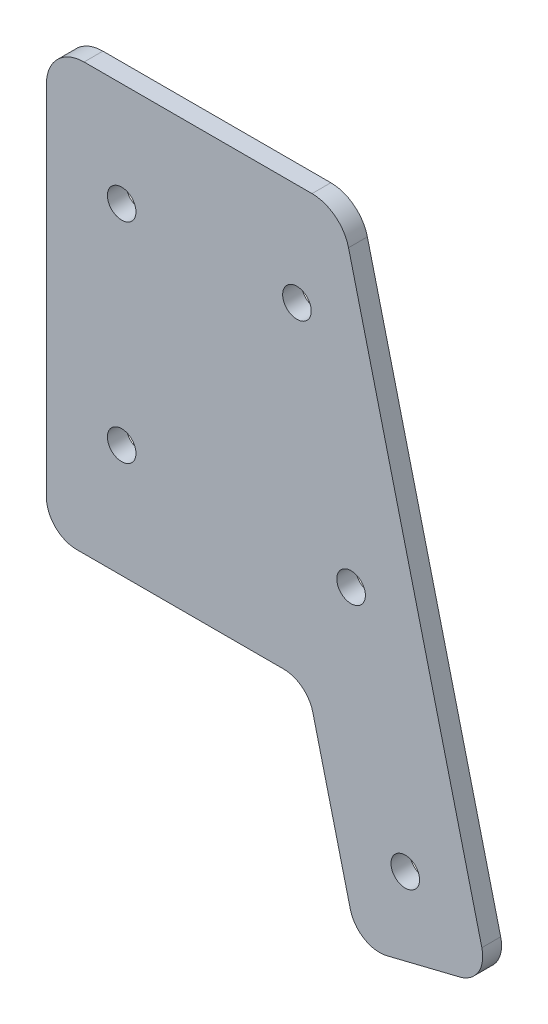
ISO-10303-21;
HEADER;
FILE_DESCRIPTION(('STEP AP214'),'2;1');
FILE_NAME('part.step','',(''),(''),'','','');
FILE_SCHEMA(('AUTOMOTIVE_DESIGN { 1 0 10303 214 1 1 1 1 }'));
ENDSEC;
DATA;
#1=APPLICATION_CONTEXT('core data for automotive mechanical design processes');
#2=APPLICATION_PROTOCOL_DEFINITION('international standard','automotive_design',2000,#1);
#3=PRODUCT_CONTEXT('',#1,'mechanical');
#4=PRODUCT('Part','Part','',(#3));
#5=PRODUCT_RELATED_PRODUCT_CATEGORY('part','',(#4));
#6=PRODUCT_DEFINITION_FORMATION('','',#4);
#7=PRODUCT_DEFINITION_CONTEXT('part definition',#1,'design');
#8=PRODUCT_DEFINITION('design','',#6,#7);
#9=PRODUCT_DEFINITION_SHAPE('','',#8);
#10=(LENGTH_UNIT() NAMED_UNIT(*) SI_UNIT(.MILLI.,.METRE.));
#11=(NAMED_UNIT(*) PLANE_ANGLE_UNIT() SI_UNIT($,.RADIAN.));
#12=(NAMED_UNIT(*) SI_UNIT($,.STERADIAN.) SOLID_ANGLE_UNIT());
#13=UNCERTAINTY_MEASURE_WITH_UNIT(LENGTH_MEASURE(1.E-05),#10,'distance_accuracy_value','');
#14=(GEOMETRIC_REPRESENTATION_CONTEXT(3) GLOBAL_UNCERTAINTY_ASSIGNED_CONTEXT((#13)) GLOBAL_UNIT_ASSIGNED_CONTEXT((#10,
#11,#12)) REPRESENTATION_CONTEXT('',''));
#15=CARTESIAN_POINT('',(0.,0.,0.));
#16=DIRECTION('',(0.,0.,1.));
#17=DIRECTION('',(1.,0.,0.));
#18=AXIS2_PLACEMENT_3D('',#15,#16,#17);
#19=CARTESIAN_POINT('',(37.552869907065,49.7064913238145,3.175));
#20=DIRECTION('',(0.,0.,-1.));
#21=DIRECTION('',(-1.,0.,0.));
#22=AXIS2_PLACEMENT_3D('',#19,#20,#21);
#23=CYLINDRICAL_SURFACE('',#22,5.08000000000005);
#24=CARTESIAN_POINT('',(37.552869907065,49.7064913238145,0.));
#25=DIRECTION('',(0.,0.,-1.));
#26=DIRECTION('',(-1.,0.,0.));
#27=AXIS2_PLACEMENT_3D('',#24,#25,#26);
#28=CIRCLE('',#27,5.08000000000005);
#29=CARTESIAN_POINT('',(37.552869907065,54.7864913238146,0.));
#30=VERTEX_POINT('',#29);
#31=CARTESIAN_POINT('',(42.4845353185074,50.925128377897,0.));
#32=VERTEX_POINT('',#31);
#33=EDGE_CURVE('E155',#30,#32,#28,.T.);
#34=ORIENTED_EDGE('',*,*,#33,.T.);
#35=DIRECTION('',(0.,0.,-1.));
#36=VECTOR('',#35,1.);
#37=CARTESIAN_POINT('',(42.4845353185074,50.925128377897,3.175));
#38=LINE('',#37,#36);
#39=CARTESIAN_POINT('',(42.4845353185074,50.925128377897,3.175));
#40=VERTEX_POINT('',#39);
#41=EDGE_CURVE('E11',#40,#32,#38,.T.);
#42=ORIENTED_EDGE('',*,*,#41,.F.);
#43=CARTESIAN_POINT('',(37.552869907065,49.7064913238145,3.175));
#44=DIRECTION('',(0.,0.,-1.));
#45=DIRECTION('',(-1.,0.,0.));
#46=AXIS2_PLACEMENT_3D('',#43,#44,#45);
#47=CIRCLE('',#46,5.08000000000005);
#48=CARTESIAN_POINT('',(37.552869907065,54.7864913238146,3.175));
#49=VERTEX_POINT('',#48);
#50=EDGE_CURVE('E178',#49,#40,#47,.T.);
#51=ORIENTED_EDGE('',*,*,#50,.F.);
#52=DIRECTION('',(0.,0.,-1.));
#53=VECTOR('',#52,1.);
#54=CARTESIAN_POINT('',(37.552869907065,54.7864913238146,3.175));
#55=LINE('',#54,#53);
#56=EDGE_CURVE('E151',#49,#30,#55,.T.);
#57=ORIENTED_EDGE('',*,*,#56,.T.);
#58=EDGE_LOOP('',(#34,#42,#51,#57));
#59=FACE_BOUND('',#58,.T.);
#60=ADVANCED_FACE('F35',(#59),#23,.F.);
#61=CARTESIAN_POINT('',(48.8138921886152,25.3110456217395,3.175));
#62=DIRECTION('',(0.970800277842994,0.239889183874483,0.));
#63=DIRECTION('',(-0.239889183874483,0.970800277842994,0.));
#64=AXIS2_PLACEMENT_3D('',#61,#62,#63);
#65=PLANE('',#64);
#66=DIRECTION('',(0.239889183874483,-0.970800277842994,0.));
#67=VECTOR('',#66,1.);
#68=CARTESIAN_POINT('',(48.8138921886152,25.3110456217395,0.));
#69=LINE('',#68,#67);
#70=CARTESIAN_POINT('',(48.8138921886152,25.3110456217395,0.));
#71=VERTEX_POINT('',#70);
#72=EDGE_CURVE('E158',#32,#71,#69,.T.);
#73=ORIENTED_EDGE('',*,*,#72,.T.);
#74=DIRECTION('',(0.,0.,-1.));
#75=VECTOR('',#74,1.);
#76=CARTESIAN_POINT('',(48.8138921886152,25.3110456217395,3.175));
#77=LINE('',#76,#75);
#78=CARTESIAN_POINT('',(48.8138921886152,25.3110456217395,3.175));
#79=VERTEX_POINT('',#78);
#80=EDGE_CURVE('E43',#79,#71,#77,.T.);
#81=ORIENTED_EDGE('',*,*,#80,.F.);
#82=DIRECTION('',(0.239889183874483,-0.970800277842994,0.));
#83=VECTOR('',#82,1.);
#84=CARTESIAN_POINT('',(48.8138921886152,25.3110456217395,3.175));
#85=LINE('',#84,#83);
#86=EDGE_CURVE('E106',#40,#79,#85,.T.);
#87=ORIENTED_EDGE('',*,*,#86,.F.);
#88=ORIENTED_EDGE('',*,*,#41,.T.);
#89=EDGE_LOOP('',(#73,#81,#87,#88));
#90=FACE_BOUND('',#89,.T.);
#91=ADVANCED_FACE('F257',(#90),#65,.F.);
#92=CARTESIAN_POINT('',(53.7455576000576,26.5296826758218,3.175));
#93=DIRECTION('',(0.,0.,-1.));
#94=DIRECTION('',(-1.,0.,0.));
#95=AXIS2_PLACEMENT_3D('',#92,#93,#94);
#96=CYLINDRICAL_SURFACE('',#95,5.08);
#97=CARTESIAN_POINT('',(53.7455576000576,26.5296826758218,0.));
#98=DIRECTION('',(0.,0.,1.));
#99=DIRECTION('',(-1.,0.,0.));
#100=AXIS2_PLACEMENT_3D('',#97,#98,#99);
#101=CIRCLE('',#100,5.08);
#102=CARTESIAN_POINT('',(54.96419465414,21.5980172643794,0.));
#103=VERTEX_POINT('',#102);
#104=EDGE_CURVE('E161',#71,#103,#101,.T.);
#105=ORIENTED_EDGE('',*,*,#104,.T.);
#106=DIRECTION('',(0.,0.,-1.));
#107=VECTOR('',#106,1.);
#108=CARTESIAN_POINT('',(54.96419465414,21.5980172643794,3.175));
#109=LINE('',#108,#107);
#110=CARTESIAN_POINT('',(54.96419465414,21.5980172643794,3.175));
#111=VERTEX_POINT('',#110);
#112=EDGE_CURVE('E197',#111,#103,#109,.T.);
#113=ORIENTED_EDGE('',*,*,#112,.F.);
#114=CARTESIAN_POINT('',(53.7455576000576,26.5296826758218,3.175));
#115=DIRECTION('',(0.,0.,1.));
#116=DIRECTION('',(-1.,0.,0.));
#117=AXIS2_PLACEMENT_3D('',#114,#115,#116);
#118=CIRCLE('',#117,5.08);
#119=EDGE_CURVE('E205',#79,#111,#118,.T.);
#120=ORIENTED_EDGE('',*,*,#119,.F.);
#121=ORIENTED_EDGE('',*,*,#80,.T.);
#122=EDGE_LOOP('',(#105,#113,#120,#121));
#123=FACE_BOUND('',#122,.T.);
#124=ADVANCED_FACE('F203',(#123),#96,.T.);
#125=CARTESIAN_POINT('',(54.96419465414,21.5980172643794,3.175));
#126=DIRECTION('',(-0.239889183874475,0.970800277842996,0.));
#127=DIRECTION('',(-0.970800277842996,-0.239889183874475,0.));
#128=AXIS2_PLACEMENT_3D('',#125,#126,#127);
#129=PLANE('',#128);
#130=DIRECTION('',(0.970800277842996,0.239889183874475,0.));
#131=VECTOR('',#130,1.);
#132=CARTESIAN_POINT('',(54.96419465414,21.5980172643794,0.));
#133=LINE('',#132,#131);
#134=CARTESIAN_POINT('',(67.2933581827458,24.6446098995852,0.));
#135=VERTEX_POINT('',#134);
#136=EDGE_CURVE('E163',#103,#135,#133,.T.);
#137=ORIENTED_EDGE('',*,*,#136,.T.);
#138=DIRECTION('',(0.,0.,-1.));
#139=VECTOR('',#138,1.);
#140=CARTESIAN_POINT('',(67.2933581827458,24.6446098995852,3.175));
#141=LINE('',#140,#139);
#142=CARTESIAN_POINT('',(67.2933581827458,24.6446098995852,3.175));
#143=VERTEX_POINT('',#142);
#144=EDGE_CURVE('E194',#143,#135,#141,.T.);
#145=ORIENTED_EDGE('',*,*,#144,.F.);
#146=DIRECTION('',(0.970800277842996,0.239889183874475,0.));
#147=VECTOR('',#146,1.);
#148=CARTESIAN_POINT('',(54.96419465414,21.5980172643794,3.175));
#149=LINE('',#148,#147);
#150=EDGE_CURVE('E223',#111,#143,#149,.T.);
#151=ORIENTED_EDGE('',*,*,#150,.F.);
#152=ORIENTED_EDGE('',*,*,#112,.T.);
#153=EDGE_LOOP('',(#137,#145,#151,#152));
#154=FACE_BOUND('',#153,.T.);
#155=ADVANCED_FACE('F214',(#154),#129,.F.);
#156=CARTESIAN_POINT('',(66.0747211286634,29.5762753110276,3.175));
#157=DIRECTION('',(0.,0.,-1.));
#158=DIRECTION('',(-1.,0.,0.));
#159=AXIS2_PLACEMENT_3D('',#156,#157,#158);
#160=CYLINDRICAL_SURFACE('',#159,5.08000000000001);
#161=CARTESIAN_POINT('',(66.0747211286634,29.5762753110276,0.));
#162=DIRECTION('',(0.,0.,1.));
#163=DIRECTION('',(-1.,0.,0.));
#164=AXIS2_PLACEMENT_3D('',#161,#162,#163);
#165=CIRCLE('',#164,5.08000000000001);
#166=CARTESIAN_POINT('',(71.0063865401059,30.79491236511,0.));
#167=VERTEX_POINT('',#166);
#168=EDGE_CURVE('E165',#135,#167,#165,.T.);
#169=ORIENTED_EDGE('',*,*,#168,.T.);
#170=DIRECTION('',(0.,0.,-1.));
#171=VECTOR('',#170,1.);
#172=CARTESIAN_POINT('',(71.0063865401059,30.79491236511,3.175));
#173=LINE('',#172,#171);
#174=CARTESIAN_POINT('',(71.0063865401059,30.79491236511,3.175));
#175=VERTEX_POINT('',#174);
#176=EDGE_CURVE('E191',#175,#167,#173,.T.);
#177=ORIENTED_EDGE('',*,*,#176,.F.);
#178=CARTESIAN_POINT('',(66.0747211286634,29.5762753110276,3.175));
#179=DIRECTION('',(0.,0.,1.));
#180=DIRECTION('',(-1.,0.,0.));
#181=AXIS2_PLACEMENT_3D('',#178,#179,#180);
#182=CIRCLE('',#181,5.08000000000001);
#183=EDGE_CURVE('E220',#143,#175,#182,.T.);
#184=ORIENTED_EDGE('',*,*,#183,.F.);
#185=ORIENTED_EDGE('',*,*,#144,.T.);
#186=EDGE_LOOP('',(#169,#177,#184,#185));
#187=FACE_BOUND('',#186,.T.);
#188=ADVANCED_FACE('F218',(#187),#160,.T.);
#189=CARTESIAN_POINT('',(48.5108678255836,121.831346211615,3.175));
#190=DIRECTION('',(-0.970800277842996,-0.239889183874475,0.));
#191=DIRECTION('',(0.239889183874475,-0.970800277842996,0.));
#192=AXIS2_PLACEMENT_3D('',#189,#190,#191);
#193=PLANE('',#192);
#194=DIRECTION('',(-0.239889183874475,0.970800277842996,0.));
#195=VECTOR('',#194,1.);
#196=CARTESIAN_POINT('',(48.5108678255836,121.831346211615,0.));
#197=LINE('',#196,#195);
#198=CARTESIAN_POINT('',(48.5108678255836,121.831346211615,0.));
#199=VERTEX_POINT('',#198);
#200=EDGE_CURVE('E167',#167,#199,#197,.T.);
#201=ORIENTED_EDGE('',*,*,#200,.T.);
#202=DIRECTION('',(0.,0.,-1.));
#203=VECTOR('',#202,1.);
#204=CARTESIAN_POINT('',(48.5108678255836,121.831346211615,3.175));
#205=LINE('',#204,#203);
#206=CARTESIAN_POINT('',(48.5108678255836,121.831346211615,3.175));
#207=VERTEX_POINT('',#206);
#208=EDGE_CURVE('E188',#207,#199,#205,.T.);
#209=ORIENTED_EDGE('',*,*,#208,.F.);
#210=DIRECTION('',(-0.239889183874475,0.970800277842996,0.));
#211=VECTOR('',#210,1.);
#212=CARTESIAN_POINT('',(48.5108678255836,121.831346211615,3.175));
#213=LINE('',#212,#211);
#214=EDGE_CURVE('E222',#175,#207,#213,.T.);
#215=ORIENTED_EDGE('',*,*,#214,.F.);
#216=ORIENTED_EDGE('',*,*,#176,.T.);
#217=EDGE_LOOP('',(#201,#209,#215,#216));
#218=FACE_BOUND('',#217,.T.);
#219=ADVANCED_FACE('F270',(#218),#193,.F.);
#220=CARTESIAN_POINT('',(42.3462860612805,120.308049894012,3.175));
#221=DIRECTION('',(0.,0.,-1.));
#222=DIRECTION('',(-1.,0.,0.));
#223=AXIS2_PLACEMENT_3D('',#220,#221,#222);
#224=CYLINDRICAL_SURFACE('',#223,6.35);
#225=CARTESIAN_POINT('',(42.3462860612805,120.308049894012,0.));
#226=DIRECTION('',(0.,0.,1.));
#227=DIRECTION('',(1.,0.,0.));
#228=AXIS2_PLACEMENT_3D('',#225,#226,#227);
#229=CIRCLE('',#228,6.35);
#230=CARTESIAN_POINT('',(42.3462860612805,126.658049894012,0.));
#231=VERTEX_POINT('',#230);
#232=EDGE_CURVE('E169',#199,#231,#229,.T.);
#233=ORIENTED_EDGE('',*,*,#232,.T.);
#234=DIRECTION('',(0.,0.,-1.));
#235=VECTOR('',#234,1.);
#236=CARTESIAN_POINT('',(42.3462860612805,126.658049894012,3.175));
#237=LINE('',#236,#235);
#238=CARTESIAN_POINT('',(42.3462860612805,126.658049894012,3.175));
#239=VERTEX_POINT('',#238);
#240=EDGE_CURVE('E185',#239,#231,#237,.T.);
#241=ORIENTED_EDGE('',*,*,#240,.F.);
#242=CARTESIAN_POINT('',(42.3462860612805,120.308049894012,3.175));
#243=DIRECTION('',(0.,0.,1.));
#244=DIRECTION('',(1.,0.,0.));
#245=AXIS2_PLACEMENT_3D('',#242,#243,#244);
#246=CIRCLE('',#245,6.35);
#247=EDGE_CURVE('E225',#207,#239,#246,.T.);
#248=ORIENTED_EDGE('',*,*,#247,.F.);
#249=ORIENTED_EDGE('',*,*,#208,.T.);
#250=EDGE_LOOP('',(#233,#241,#248,#249));
#251=FACE_BOUND('',#250,.T.);
#252=ADVANCED_FACE('F273',(#251),#224,.T.);
#253=CARTESIAN_POINT('',(3.8841672942788,126.658049894012,3.175));
#254=DIRECTION('',(0.,-1.,0.));
#255=DIRECTION('',(0.,0.,-1.));
#256=AXIS2_PLACEMENT_3D('',#253,#254,#255);
#257=PLANE('',#256);
#258=DIRECTION('',(-1.,0.,0.));
#259=VECTOR('',#258,1.);
#260=CARTESIAN_POINT('',(3.8841672942788,126.658049894012,0.));
#261=LINE('',#260,#259);
#262=CARTESIAN_POINT('',(3.8841672942788,126.658049894012,0.));
#263=VERTEX_POINT('',#262);
#264=EDGE_CURVE('E171',#231,#263,#261,.T.);
#265=ORIENTED_EDGE('',*,*,#264,.T.);
#266=DIRECTION('',(0.,0.,-1.));
#267=VECTOR('',#266,1.);
#268=CARTESIAN_POINT('',(3.8841672942788,126.658049894012,3.175));
#269=LINE('',#268,#267);
#270=CARTESIAN_POINT('',(3.8841672942788,126.658049894012,3.175));
#271=VERTEX_POINT('',#270);
#272=EDGE_CURVE('E182',#271,#263,#269,.T.);
#273=ORIENTED_EDGE('',*,*,#272,.F.);
#274=DIRECTION('',(-1.,0.,0.));
#275=VECTOR('',#274,1.);
#276=CARTESIAN_POINT('',(3.8841672942788,126.658049894012,3.175));
#277=LINE('',#276,#275);
#278=EDGE_CURVE('E231',#239,#271,#277,.T.);
#279=ORIENTED_EDGE('',*,*,#278,.F.);
#280=ORIENTED_EDGE('',*,*,#240,.T.);
#281=EDGE_LOOP('',(#265,#273,#279,#280));
#282=FACE_BOUND('',#281,.T.);
#283=ADVANCED_FACE('F237',(#282),#257,.F.);
#284=CARTESIAN_POINT('',(3.8841672942788,120.308049894012,3.175));
#285=DIRECTION('',(0.,0.,-1.));
#286=DIRECTION('',(-1.,0.,0.));
#287=AXIS2_PLACEMENT_3D('',#284,#285,#286);
#288=CYLINDRICAL_SURFACE('',#287,6.35);
#289=CARTESIAN_POINT('',(3.8841672942788,120.308049894012,0.));
#290=DIRECTION('',(0.,0.,1.));
#291=DIRECTION('',(-1.,0.,0.));
#292=AXIS2_PLACEMENT_3D('',#289,#290,#291);
#293=CIRCLE('',#292,6.35);
#294=CARTESIAN_POINT('',(-2.4658327057212,120.308049894012,0.));
#295=VERTEX_POINT('',#294);
#296=EDGE_CURVE('E173',#263,#295,#293,.T.);
#297=ORIENTED_EDGE('',*,*,#296,.T.);
#298=DIRECTION('',(0.,0.,-1.));
#299=VECTOR('',#298,1.);
#300=CARTESIAN_POINT('',(-2.4658327057212,120.308049894012,3.175));
#301=LINE('',#300,#299);
#302=CARTESIAN_POINT('',(-2.4658327057212,120.308049894012,3.175));
#303=VERTEX_POINT('',#302);
#304=EDGE_CURVE('E146',#303,#295,#301,.T.);
#305=ORIENTED_EDGE('',*,*,#304,.F.);
#306=CARTESIAN_POINT('',(3.8841672942788,120.308049894012,3.175));
#307=DIRECTION('',(0.,0.,1.));
#308=DIRECTION('',(-1.,0.,0.));
#309=AXIS2_PLACEMENT_3D('',#306,#307,#308);
#310=CIRCLE('',#309,6.35);
#311=EDGE_CURVE('E137',#271,#303,#310,.T.);
#312=ORIENTED_EDGE('',*,*,#311,.F.);
#313=ORIENTED_EDGE('',*,*,#272,.T.);
#314=EDGE_LOOP('',(#297,#305,#312,#313));
#315=FACE_BOUND('',#314,.T.);
#316=ADVANCED_FACE('F241',(#315),#288,.T.);
#317=CARTESIAN_POINT('',(-2.4658327057212,59.8664913238146,3.175));
#318=DIRECTION('',(1.,0.,0.));
#319=DIRECTION('',(0.,0.,-1.));
#320=AXIS2_PLACEMENT_3D('',#317,#318,#319);
#321=PLANE('',#320);
#322=DIRECTION('',(0.,-1.,0.));
#323=VECTOR('',#322,1.);
#324=CARTESIAN_POINT('',(-2.4658327057212,59.8664913238146,0.));
#325=LINE('',#324,#323);
#326=CARTESIAN_POINT('',(-2.4658327057212,59.8664913238146,0.));
#327=VERTEX_POINT('',#326);
#328=EDGE_CURVE('E145',#295,#327,#325,.T.);
#329=ORIENTED_EDGE('',*,*,#328,.T.);
#330=DIRECTION('',(0.,0.,-1.));
#331=VECTOR('',#330,1.);
#332=CARTESIAN_POINT('',(-2.4658327057212,59.8664913238146,3.175));
#333=LINE('',#332,#331);
#334=CARTESIAN_POINT('',(-2.4658327057212,59.8664913238146,3.175));
#335=VERTEX_POINT('',#334);
#336=EDGE_CURVE('E142',#335,#327,#333,.T.);
#337=ORIENTED_EDGE('',*,*,#336,.F.);
#338=DIRECTION('',(0.,-1.,0.));
#339=VECTOR('',#338,1.);
#340=CARTESIAN_POINT('',(-2.4658327057212,59.8664913238146,3.175));
#341=LINE('',#340,#339);
#342=EDGE_CURVE('E131',#303,#335,#341,.T.);
#343=ORIENTED_EDGE('',*,*,#342,.F.);
#344=ORIENTED_EDGE('',*,*,#304,.T.);
#345=EDGE_LOOP('',(#329,#337,#343,#344));
#346=FACE_BOUND('',#345,.T.);
#347=ADVANCED_FACE('F143',(#346),#321,.F.);
#348=CARTESIAN_POINT('',(2.6141672942788,59.8664913238146,3.175));
#349=DIRECTION('',(0.,0.,-1.));
#350=DIRECTION('',(-1.,0.,0.));
#351=AXIS2_PLACEMENT_3D('',#348,#349,#350);
#352=CYLINDRICAL_SURFACE('',#351,5.08);
#353=CARTESIAN_POINT('',(2.6141672942788,59.8664913238146,0.));
#354=DIRECTION('',(0.,0.,1.));
#355=DIRECTION('',(-1.,0.,0.));
#356=AXIS2_PLACEMENT_3D('',#353,#354,#355);
#357=CIRCLE('',#356,5.08);
#358=CARTESIAN_POINT('',(2.6141672942788,54.7864913238146,0.));
#359=VERTEX_POINT('',#358);
#360=EDGE_CURVE('E92',#327,#359,#357,.T.);
#361=ORIENTED_EDGE('',*,*,#360,.T.);
#362=DIRECTION('',(0.,0.,-1.));
#363=VECTOR('',#362,1.);
#364=CARTESIAN_POINT('',(2.6141672942788,54.7864913238146,3.175));
#365=LINE('',#364,#363);
#366=CARTESIAN_POINT('',(2.6141672942788,54.7864913238146,3.175));
#367=VERTEX_POINT('',#366);
#368=EDGE_CURVE('E147',#367,#359,#365,.T.);
#369=ORIENTED_EDGE('',*,*,#368,.F.);
#370=CARTESIAN_POINT('',(2.6141672942788,59.8664913238146,3.175));
#371=DIRECTION('',(0.,0.,1.));
#372=DIRECTION('',(-1.,0.,0.));
#373=AXIS2_PLACEMENT_3D('',#370,#371,#372);
#374=CIRCLE('',#373,5.08);
#375=EDGE_CURVE('E135',#335,#367,#374,.T.);
#376=ORIENTED_EDGE('',*,*,#375,.F.);
#377=ORIENTED_EDGE('',*,*,#336,.T.);
#378=EDGE_LOOP('',(#361,#369,#376,#377));
#379=FACE_BOUND('',#378,.T.);
#380=ADVANCED_FACE('F149',(#379),#352,.T.);
#381=CARTESIAN_POINT('',(37.552869907065,54.7864913238146,3.175));
#382=DIRECTION('',(0.,1.,0.));
#383=DIRECTION('',(-1.,0.,0.));
#384=AXIS2_PLACEMENT_3D('',#381,#382,#383);
#385=PLANE('',#384);
#386=DIRECTION('',(1.,0.,0.));
#387=VECTOR('',#386,1.);
#388=CARTESIAN_POINT('',(37.552869907065,54.7864913238146,0.));
#389=LINE('',#388,#387);
#390=EDGE_CURVE('E98',#359,#30,#389,.T.);
#391=ORIENTED_EDGE('',*,*,#390,.T.);
#392=ORIENTED_EDGE('',*,*,#56,.F.);
#393=DIRECTION('',(1.,0.,0.));
#394=VECTOR('',#393,1.);
#395=CARTESIAN_POINT('',(37.552869907065,54.7864913238146,3.175));
#396=LINE('',#395,#394);
#397=EDGE_CURVE('E51',#367,#49,#396,.T.);
#398=ORIENTED_EDGE('',*,*,#397,.F.);
#399=ORIENTED_EDGE('',*,*,#368,.T.);
#400=EDGE_LOOP('',(#391,#392,#398,#399));
#401=FACE_BOUND('',#400,.T.);
#402=ADVANCED_FACE('F245',(#401),#385,.F.);
#403=CARTESIAN_POINT('',(37.552869907065,49.7064913238145,3.175));
#404=DIRECTION('',(0.,0.,-1.));
#405=DIRECTION('',(-1.,0.,0.));
#406=AXIS2_PLACEMENT_3D('',#403,#404,#405);
#407=PLANE('',#406);
#408=CARTESIAN_POINT('',(58.0821837832369,35.4504771105883,3.175));
#409=DIRECTION('',(0.,0.,1.));
#410=DIRECTION('',(1.,0.,0.));
#411=AXIS2_PLACEMENT_3D('',#408,#409,#410);
#412=CIRCLE('',#411,2.41299999999999);
#413=CARTESIAN_POINT('',(60.4951837832369,35.4504771105883,3.175));
#414=VERTEX_POINT('',#413);
#415=EDGE_CURVE('E368',#414,#414,#412,.T.);
#416=ORIENTED_EDGE('',*,*,#415,.F.);
#417=EDGE_LOOP('',(#416));
#418=FACE_BOUND('',#417,.T.);
#419=CARTESIAN_POINT('',(48.9424058776195,72.4379676964065,3.175));
#420=DIRECTION('',(0.,0.,1.));
#421=DIRECTION('',(1.,0.,0.));
#422=AXIS2_PLACEMENT_3D('',#419,#420,#421);
#423=CIRCLE('',#422,2.41299999999999);
#424=CARTESIAN_POINT('',(51.3554058776195,72.4379676964065,3.175));
#425=VERTEX_POINT('',#424);
#426=EDGE_CURVE('E373',#425,#425,#423,.T.);
#427=ORIENTED_EDGE('',*,*,#426,.F.);
#428=EDGE_LOOP('',(#427));
#429=FACE_BOUND('',#428,.T.);
#430=CARTESIAN_POINT('',(39.802627972002,109.425458282225,3.175));
#431=DIRECTION('',(0.,0.,1.));
#432=DIRECTION('',(1.,0.,0.));
#433=AXIS2_PLACEMENT_3D('',#430,#431,#432);
#434=CIRCLE('',#433,2.41299999999999);
#435=CARTESIAN_POINT('',(42.215627972002,109.425458282225,3.175));
#436=VERTEX_POINT('',#435);
#437=EDGE_CURVE('E381',#436,#436,#434,.T.);
#438=ORIENTED_EDGE('',*,*,#437,.F.);
#439=EDGE_LOOP('',(#438));
#440=FACE_BOUND('',#439,.T.);
#441=CARTESIAN_POINT('',(10.2341672942788,109.132049894012,3.175));
#442=DIRECTION('',(0.,0.,1.));
#443=DIRECTION('',(1.,0.,0.));
#444=AXIS2_PLACEMENT_3D('',#441,#442,#443);
#445=CIRCLE('',#444,2.413);
#446=CARTESIAN_POINT('',(12.6471672942788,109.132049894012,3.175));
#447=VERTEX_POINT('',#446);
#448=EDGE_CURVE('E387',#447,#447,#445,.T.);
#449=ORIENTED_EDGE('',*,*,#448,.F.);
#450=EDGE_LOOP('',(#449));
#451=FACE_BOUND('',#450,.T.);
#452=CARTESIAN_POINT('',(10.2341672942788,73.8364913238146,3.175));
#453=DIRECTION('',(0.,0.,1.));
#454=DIRECTION('',(1.,0.,0.));
#455=AXIS2_PLACEMENT_3D('',#452,#453,#454);
#456=CIRCLE('',#455,2.413);
#457=CARTESIAN_POINT('',(12.6471672942788,73.8364913238146,3.175));
#458=VERTEX_POINT('',#457);
#459=EDGE_CURVE('E393',#458,#458,#456,.T.);
#460=ORIENTED_EDGE('',*,*,#459,.F.);
#461=EDGE_LOOP('',(#460));
#462=FACE_BOUND('',#461,.T.);
#463=ORIENTED_EDGE('',*,*,#50,.T.);
#464=ORIENTED_EDGE('',*,*,#86,.T.);
#465=ORIENTED_EDGE('',*,*,#119,.T.);
#466=ORIENTED_EDGE('',*,*,#150,.T.);
#467=ORIENTED_EDGE('',*,*,#183,.T.);
#468=ORIENTED_EDGE('',*,*,#214,.T.);
#469=ORIENTED_EDGE('',*,*,#247,.T.);
#470=ORIENTED_EDGE('',*,*,#278,.T.);
#471=ORIENTED_EDGE('',*,*,#311,.T.);
#472=ORIENTED_EDGE('',*,*,#342,.T.);
#473=ORIENTED_EDGE('',*,*,#375,.T.);
#474=ORIENTED_EDGE('',*,*,#397,.T.);
#475=EDGE_LOOP('',(#463,#464,#465,#466,#467,#468,#469,#470,#471,#472,#473,#474));
#476=FACE_BOUND('',#475,.T.);
#477=ADVANCED_FACE('F133',(#418,#429,#440,#451,#462,#476),#407,.F.);
#478=CARTESIAN_POINT('',(37.552869907065,49.7064913238145,0.));
#479=DIRECTION('',(0.,0.,-1.));
#480=DIRECTION('',(-1.,0.,0.));
#481=AXIS2_PLACEMENT_3D('',#478,#479,#480);
#482=PLANE('',#481);
#483=CARTESIAN_POINT('',(58.0821837832369,35.4504771105883,0.));
#484=DIRECTION('',(0.,0.,1.));
#485=DIRECTION('',(1.,0.,0.));
#486=AXIS2_PLACEMENT_3D('',#483,#484,#485);
#487=CIRCLE('',#486,2.41299999999999);
#488=CARTESIAN_POINT('',(60.4951837832369,35.4504771105883,0.));
#489=VERTEX_POINT('',#488);
#490=EDGE_CURVE('E159',#489,#489,#487,.T.);
#491=ORIENTED_EDGE('',*,*,#490,.T.);
#492=EDGE_LOOP('',(#491));
#493=FACE_BOUND('',#492,.T.);
#494=CARTESIAN_POINT('',(48.9424058776195,72.4379676964065,0.));
#495=DIRECTION('',(0.,0.,1.));
#496=DIRECTION('',(1.,0.,0.));
#497=AXIS2_PLACEMENT_3D('',#494,#495,#496);
#498=CIRCLE('',#497,2.41299999999999);
#499=CARTESIAN_POINT('',(51.3554058776195,72.4379676964065,0.));
#500=VERTEX_POINT('',#499);
#501=EDGE_CURVE('E369',#500,#500,#498,.T.);
#502=ORIENTED_EDGE('',*,*,#501,.T.);
#503=EDGE_LOOP('',(#502));
#504=FACE_BOUND('',#503,.T.);
#505=CARTESIAN_POINT('',(39.802627972002,109.425458282225,0.));
#506=DIRECTION('',(0.,0.,1.));
#507=DIRECTION('',(1.,0.,0.));
#508=AXIS2_PLACEMENT_3D('',#505,#506,#507);
#509=CIRCLE('',#508,2.41299999999999);
#510=CARTESIAN_POINT('',(42.215627972002,109.425458282225,0.));
#511=VERTEX_POINT('',#510);
#512=EDGE_CURVE('E378',#511,#511,#509,.T.);
#513=ORIENTED_EDGE('',*,*,#512,.T.);
#514=EDGE_LOOP('',(#513));
#515=FACE_BOUND('',#514,.T.);
#516=CARTESIAN_POINT('',(10.2341672942788,109.132049894012,0.));
#517=DIRECTION('',(0.,0.,1.));
#518=DIRECTION('',(1.,0.,0.));
#519=AXIS2_PLACEMENT_3D('',#516,#517,#518);
#520=CIRCLE('',#519,2.413);
#521=CARTESIAN_POINT('',(12.6471672942788,109.132049894012,0.));
#522=VERTEX_POINT('',#521);
#523=EDGE_CURVE('E384',#522,#522,#520,.T.);
#524=ORIENTED_EDGE('',*,*,#523,.T.);
#525=EDGE_LOOP('',(#524));
#526=FACE_BOUND('',#525,.T.);
#527=CARTESIAN_POINT('',(10.2341672942788,73.8364913238146,0.));
#528=DIRECTION('',(0.,0.,1.));
#529=DIRECTION('',(1.,0.,0.));
#530=AXIS2_PLACEMENT_3D('',#527,#528,#529);
#531=CIRCLE('',#530,2.413);
#532=CARTESIAN_POINT('',(12.6471672942788,73.8364913238146,0.));
#533=VERTEX_POINT('',#532);
#534=EDGE_CURVE('E390',#533,#533,#531,.T.);
#535=ORIENTED_EDGE('',*,*,#534,.T.);
#536=EDGE_LOOP('',(#535));
#537=FACE_BOUND('',#536,.T.);
#538=ORIENTED_EDGE('',*,*,#33,.F.);
#539=ORIENTED_EDGE('',*,*,#390,.F.);
#540=ORIENTED_EDGE('',*,*,#360,.F.);
#541=ORIENTED_EDGE('',*,*,#328,.F.);
#542=ORIENTED_EDGE('',*,*,#296,.F.);
#543=ORIENTED_EDGE('',*,*,#264,.F.);
#544=ORIENTED_EDGE('',*,*,#232,.F.);
#545=ORIENTED_EDGE('',*,*,#200,.F.);
#546=ORIENTED_EDGE('',*,*,#168,.F.);
#547=ORIENTED_EDGE('',*,*,#136,.F.);
#548=ORIENTED_EDGE('',*,*,#104,.F.);
#549=ORIENTED_EDGE('',*,*,#72,.F.);
#550=EDGE_LOOP('',(#538,#539,#540,#541,#542,#543,#544,#545,#546,#547,#548,#549));
#551=FACE_BOUND('',#550,.T.);
#552=ADVANCED_FACE('F209',(#493,#504,#515,#526,#537,#551),#482,.T.);
#553=CARTESIAN_POINT('',(10.2341672942788,73.8364913238146,0.));
#554=DIRECTION('',(0.,0.,1.));
#555=DIRECTION('',(1.,0.,0.));
#556=AXIS2_PLACEMENT_3D('',#553,#554,#555);
#557=CYLINDRICAL_SURFACE('',#556,2.413);
#558=ORIENTED_EDGE('',*,*,#534,.F.);
#559=EDGE_LOOP('',(#558));
#560=FACE_BOUND('',#559,.T.);
#561=ORIENTED_EDGE('',*,*,#459,.T.);
#562=EDGE_LOOP('',(#561));
#563=FACE_BOUND('',#562,.T.);
#564=ADVANCED_FACE('F310',(#560,#563),#557,.F.);
#565=CARTESIAN_POINT('',(10.2341672942788,109.132049894012,0.));
#566=DIRECTION('',(0.,0.,1.));
#567=DIRECTION('',(1.,0.,0.));
#568=AXIS2_PLACEMENT_3D('',#565,#566,#567);
#569=CYLINDRICAL_SURFACE('',#568,2.413);
#570=ORIENTED_EDGE('',*,*,#523,.F.);
#571=EDGE_LOOP('',(#570));
#572=FACE_BOUND('',#571,.T.);
#573=ORIENTED_EDGE('',*,*,#448,.T.);
#574=EDGE_LOOP('',(#573));
#575=FACE_BOUND('',#574,.T.);
#576=ADVANCED_FACE('F319',(#572,#575),#569,.F.);
#577=CARTESIAN_POINT('',(39.802627972002,109.425458282225,0.));
#578=DIRECTION('',(0.,0.,1.));
#579=DIRECTION('',(1.,0.,0.));
#580=AXIS2_PLACEMENT_3D('',#577,#578,#579);
#581=CYLINDRICAL_SURFACE('',#580,2.41299999999999);
#582=ORIENTED_EDGE('',*,*,#512,.F.);
#583=EDGE_LOOP('',(#582));
#584=FACE_BOUND('',#583,.T.);
#585=ORIENTED_EDGE('',*,*,#437,.T.);
#586=EDGE_LOOP('',(#585));
#587=FACE_BOUND('',#586,.T.);
#588=ADVANCED_FACE('F329',(#584,#587),#581,.F.);
#589=CARTESIAN_POINT('',(48.9424058776195,72.4379676964065,0.));
#590=DIRECTION('',(0.,0.,1.));
#591=DIRECTION('',(1.,0.,0.));
#592=AXIS2_PLACEMENT_3D('',#589,#590,#591);
#593=CYLINDRICAL_SURFACE('',#592,2.41299999999999);
#594=ORIENTED_EDGE('',*,*,#501,.F.);
#595=EDGE_LOOP('',(#594));
#596=FACE_BOUND('',#595,.T.);
#597=ORIENTED_EDGE('',*,*,#426,.T.);
#598=EDGE_LOOP('',(#597));
#599=FACE_BOUND('',#598,.T.);
#600=ADVANCED_FACE('F339',(#596,#599),#593,.F.);
#601=CARTESIAN_POINT('',(58.0821837832369,35.4504771105883,0.));
#602=DIRECTION('',(0.,0.,1.));
#603=DIRECTION('',(1.,0.,0.));
#604=AXIS2_PLACEMENT_3D('',#601,#602,#603);
#605=CYLINDRICAL_SURFACE('',#604,2.41299999999999);
#606=ORIENTED_EDGE('',*,*,#490,.F.);
#607=EDGE_LOOP('',(#606));
#608=FACE_BOUND('',#607,.T.);
#609=ORIENTED_EDGE('',*,*,#415,.T.);
#610=EDGE_LOOP('',(#609));
#611=FACE_BOUND('',#610,.T.);
#612=ADVANCED_FACE('F349',(#608,#611),#605,.F.);
#613=CLOSED_SHELL('',(#60,#91,#124,#155,#188,#219,#252,#283,#316,#347,#380,#402,#477,#552,#564,
#576,#588,#600,#612));
#614=MANIFOLD_SOLID_BREP('B2',#613);
#615=ADVANCED_BREP_SHAPE_REPRESENTATION('',(#18,#614),#14);
#616=SHAPE_DEFINITION_REPRESENTATION(#9,#615);
ENDSEC;
END-ISO-10303-21;
